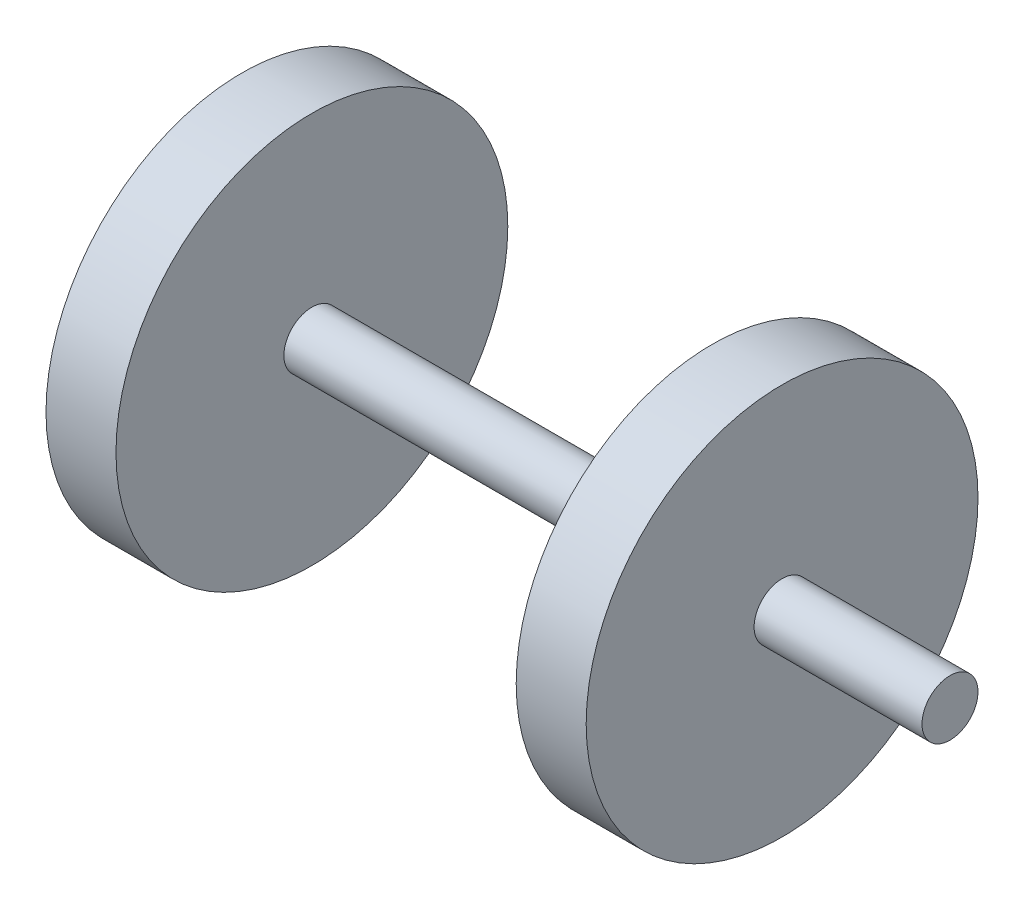
ISO-10303-21;
HEADER;
FILE_DESCRIPTION(('STEP AP214'),'2;1');
FILE_NAME('part.step','',(''),(''),'','','');
FILE_SCHEMA(('AUTOMOTIVE_DESIGN { 1 0 10303 214 1 1 1 1 }'));
ENDSEC;
DATA;
#1=APPLICATION_CONTEXT('core data for automotive mechanical design processes');
#2=APPLICATION_PROTOCOL_DEFINITION('international standard','automotive_design',2000,#1);
#3=PRODUCT_CONTEXT('',#1,'mechanical');
#4=PRODUCT('Part','Part','',(#3));
#5=PRODUCT_RELATED_PRODUCT_CATEGORY('part','',(#4));
#6=PRODUCT_DEFINITION_FORMATION('','',#4);
#7=PRODUCT_DEFINITION_CONTEXT('part definition',#1,'design');
#8=PRODUCT_DEFINITION('design','',#6,#7);
#9=PRODUCT_DEFINITION_SHAPE('','',#8);
#10=(LENGTH_UNIT() NAMED_UNIT(*) SI_UNIT(.MILLI.,.METRE.));
#11=(NAMED_UNIT(*) PLANE_ANGLE_UNIT() SI_UNIT($,.RADIAN.));
#12=(NAMED_UNIT(*) SI_UNIT($,.STERADIAN.) SOLID_ANGLE_UNIT());
#13=UNCERTAINTY_MEASURE_WITH_UNIT(LENGTH_MEASURE(1.E-05),#10,'distance_accuracy_value','');
#14=(GEOMETRIC_REPRESENTATION_CONTEXT(3) GLOBAL_UNCERTAINTY_ASSIGNED_CONTEXT((#13)) GLOBAL_UNIT_ASSIGNED_CONTEXT((#10,
#11,#12)) REPRESENTATION_CONTEXT('',''));
#15=CARTESIAN_POINT('',(0.,0.,0.));
#16=DIRECTION('',(0.,0.,1.));
#17=DIRECTION('',(1.,0.,0.));
#18=AXIS2_PLACEMENT_3D('',#15,#16,#17);
#19=CARTESIAN_POINT('',(0.,0.,0.));
#20=DIRECTION('',(1.,0.,0.));
#21=DIRECTION('',(0.,0.,-1.));
#22=AXIS2_PLACEMENT_3D('',#19,#20,#21);
#23=PLANE('',#22);
#24=CARTESIAN_POINT('',(0.,0.,0.));
#25=DIRECTION('',(-1.,0.,0.));
#26=DIRECTION('',(0.,0.,1.));
#27=AXIS2_PLACEMENT_3D('',#24,#25,#26);
#28=CIRCLE('',#27,35.);
#29=CARTESIAN_POINT('',(0.,0.,35.));
#30=VERTEX_POINT('',#29);
#31=EDGE_CURVE('E10',#30,#30,#28,.T.);
#32=ORIENTED_EDGE('',*,*,#31,.T.);
#33=EDGE_LOOP('',(#32));
#34=FACE_BOUND('',#33,.T.);
#35=ADVANCED_FACE('F33',(#34),#23,.F.);
#36=CARTESIAN_POINT('',(12.5,0.,0.));
#37=DIRECTION('',(-1.,0.,0.));
#38=DIRECTION('',(0.,0.,1.));
#39=AXIS2_PLACEMENT_3D('',#36,#37,#38);
#40=CYLINDRICAL_SURFACE('',#39,35.);
#41=ORIENTED_EDGE('',*,*,#31,.F.);
#42=EDGE_LOOP('',(#41));
#43=FACE_BOUND('',#42,.T.);
#44=CARTESIAN_POINT('',(12.5,0.,0.));
#45=DIRECTION('',(-1.,0.,0.));
#46=DIRECTION('',(0.,0.,1.));
#47=AXIS2_PLACEMENT_3D('',#44,#45,#46);
#48=CIRCLE('',#47,35.);
#49=CARTESIAN_POINT('',(12.5,0.,35.));
#50=VERTEX_POINT('',#49);
#51=EDGE_CURVE('E39',#50,#50,#48,.T.);
#52=ORIENTED_EDGE('',*,*,#51,.T.);
#53=EDGE_LOOP('',(#52));
#54=FACE_BOUND('',#53,.T.);
#55=ADVANCED_FACE('F77',(#43,#54),#40,.T.);
#56=CARTESIAN_POINT('',(12.5,5.,0.));
#57=DIRECTION('',(-1.,0.,0.));
#58=DIRECTION('',(0.,0.,1.));
#59=AXIS2_PLACEMENT_3D('',#56,#57,#58);
#60=PLANE('',#59);
#61=ORIENTED_EDGE('',*,*,#51,.F.);
#62=EDGE_LOOP('',(#61));
#63=FACE_BOUND('',#62,.T.);
#64=CARTESIAN_POINT('',(12.5,0.,0.));
#65=DIRECTION('',(-1.,0.,0.));
#66=DIRECTION('',(0.,0.,1.));
#67=AXIS2_PLACEMENT_3D('',#64,#65,#66);
#68=CIRCLE('',#67,5.);
#69=CARTESIAN_POINT('',(12.5,0.,5.));
#70=VERTEX_POINT('',#69);
#71=EDGE_CURVE('E43',#70,#70,#68,.T.);
#72=ORIENTED_EDGE('',*,*,#71,.T.);
#73=EDGE_LOOP('',(#72));
#74=FACE_BOUND('',#73,.T.);
#75=ADVANCED_FACE('F81',(#63,#74),#60,.F.);
#76=CARTESIAN_POINT('',(12.5,0.,0.));
#77=DIRECTION('',(-1.,0.,0.));
#78=DIRECTION('',(0.,0.,1.));
#79=AXIS2_PLACEMENT_3D('',#76,#77,#78);
#80=CYLINDRICAL_SURFACE('',#79,5.);
#81=ORIENTED_EDGE('',*,*,#71,.F.);
#82=EDGE_LOOP('',(#81));
#83=FACE_BOUND('',#82,.T.);
#84=CARTESIAN_POINT('',(84.,0.,0.));
#85=DIRECTION('',(-1.,0.,0.));
#86=DIRECTION('',(0.,0.,1.));
#87=AXIS2_PLACEMENT_3D('',#84,#85,#86);
#88=CIRCLE('',#87,5.);
#89=CARTESIAN_POINT('',(84.,0.,5.));
#90=VERTEX_POINT('',#89);
#91=EDGE_CURVE('E47',#90,#90,#88,.T.);
#92=ORIENTED_EDGE('',*,*,#91,.T.);
#93=EDGE_LOOP('',(#92));
#94=FACE_BOUND('',#93,.T.);
#95=ADVANCED_FACE('F86',(#83,#94),#80,.T.);
#96=CARTESIAN_POINT('',(84.,5.,0.));
#97=DIRECTION('',(1.,0.,0.));
#98=DIRECTION('',(0.,0.,-1.));
#99=AXIS2_PLACEMENT_3D('',#96,#97,#98);
#100=PLANE('',#99);
#101=ORIENTED_EDGE('',*,*,#91,.F.);
#102=EDGE_LOOP('',(#101));
#103=FACE_BOUND('',#102,.T.);
#104=CARTESIAN_POINT('',(84.,0.,0.));
#105=DIRECTION('',(-1.,0.,0.));
#106=DIRECTION('',(0.,0.,1.));
#107=AXIS2_PLACEMENT_3D('',#104,#105,#106);
#108=CIRCLE('',#107,35.);
#109=CARTESIAN_POINT('',(84.,0.,35.));
#110=VERTEX_POINT('',#109);
#111=EDGE_CURVE('E52',#110,#110,#108,.T.);
#112=ORIENTED_EDGE('',*,*,#111,.T.);
#113=EDGE_LOOP('',(#112));
#114=FACE_BOUND('',#113,.T.);
#115=ADVANCED_FACE('F92',(#103,#114),#100,.F.);
#116=CARTESIAN_POINT('',(12.5,0.,0.));
#117=DIRECTION('',(-1.,0.,0.));
#118=DIRECTION('',(0.,0.,1.));
#119=AXIS2_PLACEMENT_3D('',#116,#117,#118);
#120=CYLINDRICAL_SURFACE('',#119,35.);
#121=ORIENTED_EDGE('',*,*,#111,.F.);
#122=EDGE_LOOP('',(#121));
#123=FACE_BOUND('',#122,.T.);
#124=CARTESIAN_POINT('',(96.5,0.,0.));
#125=DIRECTION('',(-1.,0.,0.));
#126=DIRECTION('',(0.,0.,1.));
#127=AXIS2_PLACEMENT_3D('',#124,#125,#126);
#128=CIRCLE('',#127,35.);
#129=CARTESIAN_POINT('',(96.5,0.,35.));
#130=VERTEX_POINT('',#129);
#131=EDGE_CURVE('E55',#130,#130,#128,.T.);
#132=ORIENTED_EDGE('',*,*,#131,.T.);
#133=EDGE_LOOP('',(#132));
#134=FACE_BOUND('',#133,.T.);
#135=ADVANCED_FACE('F96',(#123,#134),#120,.T.);
#136=CARTESIAN_POINT('',(96.5,35.,0.));
#137=DIRECTION('',(-1.,0.,0.));
#138=DIRECTION('',(0.,0.,1.));
#139=AXIS2_PLACEMENT_3D('',#136,#137,#138);
#140=PLANE('',#139);
#141=ORIENTED_EDGE('',*,*,#131,.F.);
#142=EDGE_LOOP('',(#141));
#143=FACE_BOUND('',#142,.T.);
#144=CARTESIAN_POINT('',(96.5,0.,0.));
#145=DIRECTION('',(-1.,0.,0.));
#146=DIRECTION('',(0.,0.,1.));
#147=AXIS2_PLACEMENT_3D('',#144,#145,#146);
#148=CIRCLE('',#147,5.);
#149=CARTESIAN_POINT('',(96.5,0.,5.));
#150=VERTEX_POINT('',#149);
#151=EDGE_CURVE('E58',#150,#150,#148,.T.);
#152=ORIENTED_EDGE('',*,*,#151,.T.);
#153=EDGE_LOOP('',(#152));
#154=FACE_BOUND('',#153,.T.);
#155=ADVANCED_FACE('F73',(#143,#154),#140,.F.);
#156=CARTESIAN_POINT('',(12.5,0.,0.));
#157=DIRECTION('',(-1.,0.,0.));
#158=DIRECTION('',(0.,0.,1.));
#159=AXIS2_PLACEMENT_3D('',#156,#157,#158);
#160=CYLINDRICAL_SURFACE('',#159,5.);
#161=ORIENTED_EDGE('',*,*,#151,.F.);
#162=EDGE_LOOP('',(#161));
#163=FACE_BOUND('',#162,.T.);
#164=CARTESIAN_POINT('',(126.5,0.,0.));
#165=DIRECTION('',(-1.,0.,0.));
#166=DIRECTION('',(0.,0.,1.));
#167=AXIS2_PLACEMENT_3D('',#164,#165,#166);
#168=CIRCLE('',#167,5.);
#169=CARTESIAN_POINT('',(126.5,0.,5.));
#170=VERTEX_POINT('',#169);
#171=EDGE_CURVE('E61',#170,#170,#168,.T.);
#172=ORIENTED_EDGE('',*,*,#171,.T.);
#173=EDGE_LOOP('',(#172));
#174=FACE_BOUND('',#173,.T.);
#175=ADVANCED_FACE('F65',(#163,#174),#160,.T.);
#176=CARTESIAN_POINT('',(126.5,5.,0.));
#177=DIRECTION('',(-1.,0.,0.));
#178=DIRECTION('',(0.,0.,1.));
#179=AXIS2_PLACEMENT_3D('',#176,#177,#178);
#180=PLANE('',#179);
#181=ORIENTED_EDGE('',*,*,#171,.F.);
#182=EDGE_LOOP('',(#181));
#183=FACE_BOUND('',#182,.T.);
#184=ADVANCED_FACE('F67',(#183),#180,.F.);
#185=CLOSED_SHELL('',(#35,#55,#75,#95,#115,#135,#155,#175,#184));
#186=MANIFOLD_SOLID_BREP('B2',#185);
#187=ADVANCED_BREP_SHAPE_REPRESENTATION('',(#18,#186),#14);
#188=SHAPE_DEFINITION_REPRESENTATION(#9,#187);
ENDSEC;
END-ISO-10303-21;
